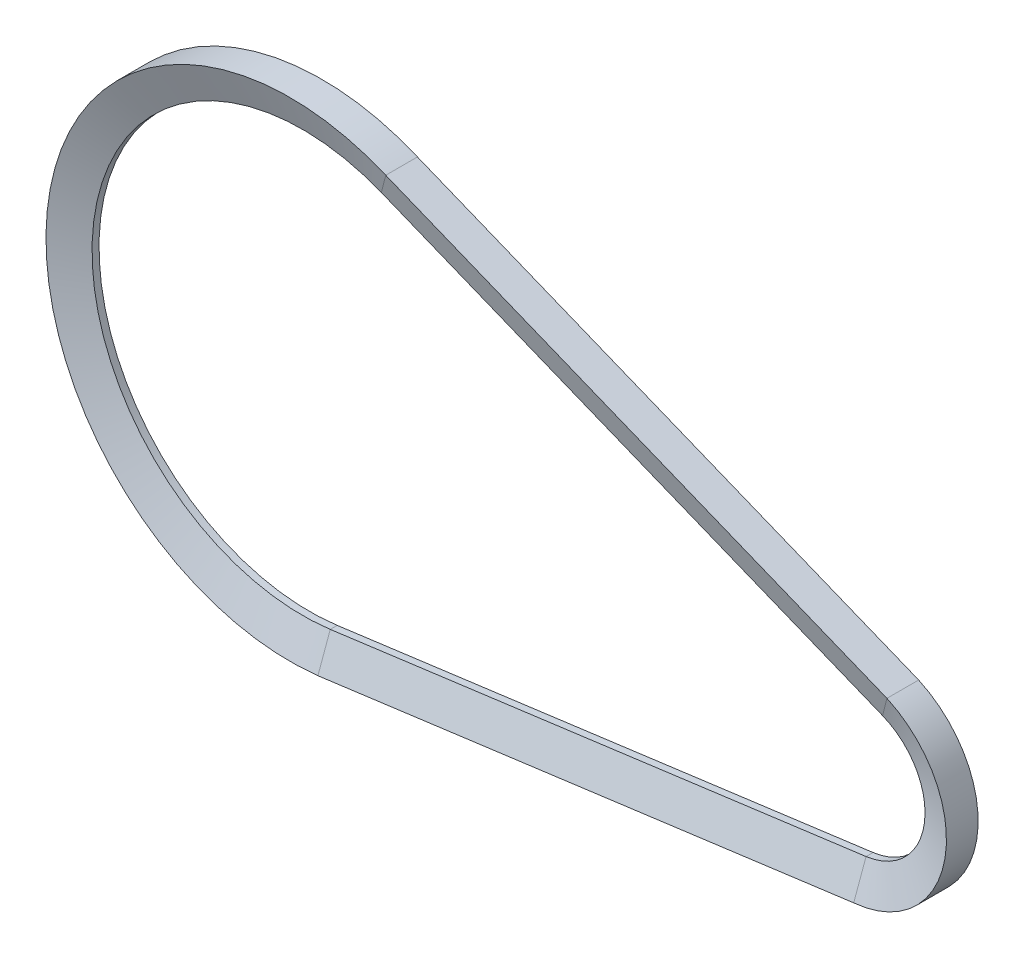
ISO-10303-21;
HEADER;
FILE_DESCRIPTION(('STEP AP214'),'2;1');
FILE_NAME('part.step','',(''),(''),'','','');
FILE_SCHEMA(('AUTOMOTIVE_DESIGN { 1 0 10303 214 1 1 1 1 }'));
ENDSEC;
DATA;
#1=APPLICATION_CONTEXT('core data for automotive mechanical design processes');
#2=APPLICATION_PROTOCOL_DEFINITION('international standard','automotive_design',2000,#1);
#3=PRODUCT_CONTEXT('',#1,'mechanical');
#4=PRODUCT('Part','Part','',(#3));
#5=PRODUCT_RELATED_PRODUCT_CATEGORY('part','',(#4));
#6=PRODUCT_DEFINITION_FORMATION('','',#4);
#7=PRODUCT_DEFINITION_CONTEXT('part definition',#1,'design');
#8=PRODUCT_DEFINITION('design','',#6,#7);
#9=PRODUCT_DEFINITION_SHAPE('','',#8);
#10=(LENGTH_UNIT() NAMED_UNIT(*) SI_UNIT(.MILLI.,.METRE.));
#11=(NAMED_UNIT(*) PLANE_ANGLE_UNIT() SI_UNIT($,.RADIAN.));
#12=(NAMED_UNIT(*) SI_UNIT($,.STERADIAN.) SOLID_ANGLE_UNIT());
#13=UNCERTAINTY_MEASURE_WITH_UNIT(LENGTH_MEASURE(1.E-05),#10,'distance_accuracy_value','');
#14=(GEOMETRIC_REPRESENTATION_CONTEXT(3) GLOBAL_UNCERTAINTY_ASSIGNED_CONTEXT((#13)) GLOBAL_UNIT_ASSIGNED_CONTEXT((#10,
#11,#12)) REPRESENTATION_CONTEXT('',''));
#15=CARTESIAN_POINT('',(0.,0.,0.));
#16=DIRECTION('',(0.,0.,1.));
#17=DIRECTION('',(1.,0.,0.));
#18=AXIS2_PLACEMENT_3D('',#15,#16,#17);
#19=CARTESIAN_POINT('',(0.,0.,0.));
#20=DIRECTION('',(0.,0.,1.));
#21=DIRECTION('',(1.,0.,0.));
#22=AXIS2_PLACEMENT_3D('',#19,#20,#21);
#23=CYLINDRICAL_SURFACE('',#22,46.5);
#24=CARTESIAN_POINT('',(0.,0.,-0.770223243003475));
#25=DIRECTION('',(0.,0.,1.));
#26=DIRECTION('',(0.374467126181139,0.927240190786421,0.));
#27=AXIS2_PLACEMENT_3D('',#24,#25,#26);
#28=CIRCLE('',#27,46.5);
#29=CARTESIAN_POINT('',(17.412721367423,43.1166688715686,-0.770223243003475));
#30=VERTEX_POINT('',#29);
#31=CARTESIAN_POINT('',(6.12472985088943,-46.0948769849061,-0.770223243003475));
#32=VERTEX_POINT('',#31);
#33=EDGE_CURVE('E11',#30,#32,#28,.T.);
#34=ORIENTED_EDGE('',*,*,#33,.F.);
#35=DIRECTION('',(0.,0.,1.));
#36=VECTOR('',#35,1.);
#37=CARTESIAN_POINT('',(17.412721367423,43.1166688715686,0.770223243003475));
#38=LINE('',#37,#36);
#39=CARTESIAN_POINT('',(17.412721367423,43.1166688715686,0.770223243003475));
#40=VERTEX_POINT('',#39);
#41=EDGE_CURVE('E36',#30,#40,#38,.T.);
#42=ORIENTED_EDGE('',*,*,#41,.T.);
#43=CARTESIAN_POINT('',(0.,0.,0.770223243003475));
#44=DIRECTION('',(0.,0.,1.));
#45=DIRECTION('',(0.374467126181139,0.927240190786421,0.));
#46=AXIS2_PLACEMENT_3D('',#43,#44,#45);
#47=CIRCLE('',#46,46.5);
#48=CARTESIAN_POINT('',(6.12472985088943,-46.0948769849061,0.770223243003475));
#49=VERTEX_POINT('',#48);
#50=EDGE_CURVE('E118',#40,#49,#47,.T.);
#51=ORIENTED_EDGE('',*,*,#50,.T.);
#52=DIRECTION('',(0.,0.,1.));
#53=VECTOR('',#52,1.);
#54=CARTESIAN_POINT('',(6.12472985088943,-46.0948769849061,0.770223243003475));
#55=LINE('',#54,#53);
#56=EDGE_CURVE('E121',#32,#49,#55,.T.);
#57=ORIENTED_EDGE('',*,*,#56,.F.);
#58=EDGE_LOOP('',(#34,#42,#51,#57));
#59=FACE_BOUND('',#58,.T.);
#60=ADVANCED_FACE('F33',(#59),#23,.F.);
#61=CARTESIAN_POINT('',(21.1127393983367,49.6404612173529,-3.5));
#62=CARTESIAN_POINT('',(-14.3055621138431,64.7043295098772,-3.5));
#63=CARTESIAN_POINT('',(-47.8541018353016,45.8397676941361,-3.5));
#64=CARTESIAN_POINT('',(-53.3840209820254,7.75044892662747,-3.5));
#65=CARTESIAN_POINT('',(-58.9139401287492,-30.3388698408812,-3.5));
#66=CARTESIAN_POINT('',(-32.1150339629088,-57.9648510588701,-3.5));
#67=CARTESIAN_POINT('',(6.12472985088941,-53.5948769849061,-3.5));
#68=CARTESIAN_POINT('',(17.412721367423,43.1166688715686,-0.770223243003475));
#69=CARTESIAN_POINT('',(-13.3508763277611,55.5405867888214,-0.770223243003475));
#70=CARTESIAN_POINT('',(-41.9674038383494,38.7522863149345,-0.770223243003475));
#71=CARTESIAN_POINT('',(-46.1321783681313,5.8371327731105,-0.770223243003475));
#72=CARTESIAN_POINT('',(-50.2969528979131,-27.0780207687135,-0.770223243003475));
#73=CARTESIAN_POINT('',(-26.763809279918,-50.4648510588701,-0.770223243003475));
#74=CARTESIAN_POINT('',(6.12472985088941,-46.0948769849061,-0.770223243003475));
#75=(BOUNDED_SURFACE() B_SPLINE_SURFACE(1,3,((#61,#62,#63,#64,#65,#66,#67),(#68,#69,#70,#71,#72,
#73,#74)),.UNSPECIFIED.,.F.,.F.,.F.) B_SPLINE_SURFACE_WITH_KNOTS((2,2),(4,3,4),(0.,1.),(0.,0.5,
1.),.UNSPECIFIED.) GEOMETRIC_REPRESENTATION_ITEM() RATIONAL_B_SPLINE_SURFACE(((1.,
0.740188803038642,0.740188803038642,1.,0.740188803038642,0.740188803038642,1.),(1.,
0.740188803038642,0.740188803038642,1.,0.740188803038642,0.740188803038642,1.))) REPRESENTATION_ITEM('') SURFACE());
#76=CARTESIAN_POINT('',(0.,0.,-3.5));
#77=DIRECTION('',(0.,0.,1.));
#78=DIRECTION('',(0.391384684427716,0.920227161517968,0.));
#79=AXIS2_PLACEMENT_3D('',#76,#77,#78);
#80=CIRCLE('',#79,53.94370356931);
#81=CARTESIAN_POINT('',(21.1127393983367,49.6404612173529,-3.5));
#82=VERTEX_POINT('',#81);
#83=CARTESIAN_POINT('',(6.12472985088943,-53.5948769849061,-3.5));
#84=VERTEX_POINT('',#83);
#85=EDGE_CURVE('E41',#82,#84,#80,.T.);
#86=DIRECTION('',(-0.463583952056587,-0.817381270249743,0.34202014332567));
#87=VECTOR('',#86,1.);
#88=CARTESIAN_POINT('',(17.412721367423,43.1166688715686,-0.770223243003475));
#89=LINE('',#88,#87);
#90=EDGE_CURVE('E187',#82,#30,#89,.T.);
#91=DIRECTION('',(0.,0.939692620785908,0.34202014332567));
#92=VECTOR('',#91,1.);
#93=CARTESIAN_POINT('',(6.12472985088943,-46.0948769849061,-0.770223243003475));
#94=LINE('',#93,#92);
#95=EDGE_CURVE('E146',#84,#32,#94,.T.);
#96=ORIENTED_EDGE('',*,*,#85,.F.);
#97=ORIENTED_EDGE('',*,*,#90,.T.);
#98=ORIENTED_EDGE('',*,*,#33,.T.);
#99=ORIENTED_EDGE('',*,*,#95,.F.);
#100=EDGE_LOOP('',(#96,#97,#98,#99));
#101=FACE_BOUND('',#100,.T.);
#102=ADVANCED_FACE('F227',(#101),#75,.T.);
#103=CARTESIAN_POINT('',(0.,0.,0.));
#104=DIRECTION('',(0.,0.,1.));
#105=DIRECTION('',(1.,0.,0.));
#106=AXIS2_PLACEMENT_3D('',#103,#104,#105);
#107=CYLINDRICAL_SURFACE('',#106,53.94370356931);
#108=CARTESIAN_POINT('',(0.,0.,3.5));
#109=DIRECTION('',(0.,0.,1.));
#110=DIRECTION('',(0.391384684427716,0.920227161517968,0.));
#111=AXIS2_PLACEMENT_3D('',#108,#109,#110);
#112=CIRCLE('',#111,53.94370356931);
#113=CARTESIAN_POINT('',(21.1127393983367,49.6404612173529,3.5));
#114=VERTEX_POINT('',#113);
#115=CARTESIAN_POINT('',(6.12472985088943,-53.5948769849061,3.5));
#116=VERTEX_POINT('',#115);
#117=EDGE_CURVE('E127',#114,#116,#112,.T.);
#118=ORIENTED_EDGE('',*,*,#117,.F.);
#119=DIRECTION('',(0.,0.,-1.));
#120=VECTOR('',#119,1.);
#121=CARTESIAN_POINT('',(21.1127393983367,49.6404612173529,3.5));
#122=LINE('',#121,#120);
#123=EDGE_CURVE('E171',#114,#82,#122,.T.);
#124=ORIENTED_EDGE('',*,*,#123,.T.);
#125=ORIENTED_EDGE('',*,*,#85,.T.);
#126=DIRECTION('',(0.,0.,-1.));
#127=VECTOR('',#126,1.);
#128=CARTESIAN_POINT('',(6.12472985088943,-53.5948769849061,3.5));
#129=LINE('',#128,#127);
#130=EDGE_CURVE('E151',#116,#84,#129,.T.);
#131=ORIENTED_EDGE('',*,*,#130,.F.);
#132=EDGE_LOOP('',(#118,#124,#125,#131));
#133=FACE_BOUND('',#132,.T.);
#134=ADVANCED_FACE('F223',(#133),#107,.T.);
#135=CARTESIAN_POINT('',(128.117006892717,-1.59139713820367,0.770223243003475));
#136=DIRECTION('',(-0.374467126181139,-0.927240190786421,0.));
#137=DIRECTION('',(0.927240190786421,-0.374467126181139,0.));
#138=AXIS2_PLACEMENT_3D('',#135,#136,#137);
#139=PLANE('',#138);
#140=ORIENTED_EDGE('',*,*,#41,.F.);
#141=DIRECTION('',(-0.927240190786421,0.374467126181139,0.));
#142=VECTOR('',#141,1.);
#143=CARTESIAN_POINT('',(128.117006892717,-1.59139713820367,-0.770223243003475));
#144=LINE('',#143,#142);
#145=CARTESIAN_POINT('',(128.117006892717,-1.59139713820366,-0.770223243003475));
#146=VERTEX_POINT('',#145);
#147=EDGE_CURVE('E49',#146,#30,#144,.T.);
#148=ORIENTED_EDGE('',*,*,#147,.F.);
#149=DIRECTION('',(0.,0.,1.));
#150=VECTOR('',#149,1.);
#151=CARTESIAN_POINT('',(128.117006892717,-1.59139713820367,0.770223243003475));
#152=LINE('',#151,#150);
#153=CARTESIAN_POINT('',(128.117006892717,-1.59139713820366,0.770223243003475));
#154=VERTEX_POINT('',#153);
#155=EDGE_CURVE('E175',#146,#154,#152,.T.);
#156=ORIENTED_EDGE('',*,*,#155,.T.);
#157=DIRECTION('',(-0.927240190786421,0.374467126181139,0.));
#158=VECTOR('',#157,1.);
#159=CARTESIAN_POINT('',(128.117006892717,-1.59139713820367,0.770223243003475));
#160=LINE('',#159,#158);
#161=EDGE_CURVE('E173',#154,#40,#160,.T.);
#162=ORIENTED_EDGE('',*,*,#161,.T.);
#163=EDGE_LOOP('',(#140,#148,#156,#162));
#164=FACE_BOUND('',#163,.T.);
#165=ADVANCED_FACE('F202',(#164),#139,.T.);
#166=CARTESIAN_POINT('',(128.117006892717,-1.59139713820367,-0.770223243003475));
#167=DIRECTION('',(-0.129067730873885,-0.319592239298412,-0.938723772697428));
#168=DIRECTION('',(0.,0.946641691748173,-0.322287926308383));
#169=AXIS2_PLACEMENT_3D('',#166,#167,#168);
#170=PLANE('',#169);
#171=ORIENTED_EDGE('',*,*,#147,.T.);
#172=ORIENTED_EDGE('',*,*,#90,.F.);
#173=DIRECTION('',(-0.927240190786421,0.374467126181139,0.));
#174=VECTOR('',#173,1.);
#175=CARTESIAN_POINT('',(131.817024923631,4.9323952075806,-3.5));
#176=LINE('',#175,#174);
#177=CARTESIAN_POINT('',(131.817024923631,4.93239520758062,-3.5));
#178=VERTEX_POINT('',#177);
#179=EDGE_CURVE('E58',#178,#82,#176,.T.);
#180=ORIENTED_EDGE('',*,*,#179,.F.);
#181=DIRECTION('',(-0.463583952056588,-0.817381270249743,0.34202014332567));
#182=VECTOR('',#181,1.);
#183=CARTESIAN_POINT('',(128.117006892717,-1.59139713820367,-0.770223243003475));
#184=LINE('',#183,#182);
#185=EDGE_CURVE('E184',#178,#146,#184,.T.);
#186=ORIENTED_EDGE('',*,*,#185,.T.);
#187=EDGE_LOOP('',(#171,#172,#180,#186));
#188=FACE_BOUND('',#187,.T.);
#189=ADVANCED_FACE('F213',(#188),#170,.T.);
#190=CARTESIAN_POINT('',(131.817024923631,4.9323952075806,3.5));
#191=DIRECTION('',(0.374467126181139,0.927240190786421,0.));
#192=DIRECTION('',(-0.927240190786421,0.374467126181139,0.));
#193=AXIS2_PLACEMENT_3D('',#190,#191,#192);
#194=PLANE('',#193);
#195=ORIENTED_EDGE('',*,*,#179,.T.);
#196=ORIENTED_EDGE('',*,*,#123,.F.);
#197=DIRECTION('',(-0.927240190786421,0.374467126181139,0.));
#198=VECTOR('',#197,1.);
#199=CARTESIAN_POINT('',(131.817024923631,4.9323952075806,3.5));
#200=LINE('',#199,#198);
#201=CARTESIAN_POINT('',(131.817024923631,4.93239520758062,3.5));
#202=VERTEX_POINT('',#201);
#203=EDGE_CURVE('E86',#202,#114,#200,.T.);
#204=ORIENTED_EDGE('',*,*,#203,.F.);
#205=DIRECTION('',(0.,0.,-1.));
#206=VECTOR('',#205,1.);
#207=CARTESIAN_POINT('',(131.817024923631,4.93239520758061,3.5));
#208=LINE('',#207,#206);
#209=EDGE_CURVE('E165',#202,#178,#208,.T.);
#210=ORIENTED_EDGE('',*,*,#209,.T.);
#211=EDGE_LOOP('',(#195,#196,#204,#210));
#212=FACE_BOUND('',#211,.T.);
#213=ADVANCED_FACE('F215',(#212),#194,.T.);
#214=CARTESIAN_POINT('',(128.117006892717,-1.59139713820367,0.770223243003475));
#215=DIRECTION('',(-0.129067730873885,-0.319592239298412,0.938723772697428));
#216=DIRECTION('',(0.,-0.946641691748173,-0.322287926308383));
#217=AXIS2_PLACEMENT_3D('',#214,#215,#216);
#218=PLANE('',#217);
#219=ORIENTED_EDGE('',*,*,#203,.T.);
#220=DIRECTION('',(0.463583952056587,0.817381270249743,0.34202014332567));
#221=VECTOR('',#220,1.);
#222=CARTESIAN_POINT('',(17.412721367423,43.1166688715686,0.770223243003475));
#223=LINE('',#222,#221);
#224=EDGE_CURVE('E169',#40,#114,#223,.T.);
#225=ORIENTED_EDGE('',*,*,#224,.F.);
#226=ORIENTED_EDGE('',*,*,#161,.F.);
#227=DIRECTION('',(0.463583952056588,0.817381270249743,0.34202014332567));
#228=VECTOR('',#227,1.);
#229=CARTESIAN_POINT('',(128.117006892717,-1.59139713820367,0.770223243003475));
#230=LINE('',#229,#228);
#231=EDGE_CURVE('E160',#154,#202,#230,.T.);
#232=ORIENTED_EDGE('',*,*,#231,.T.);
#233=EDGE_LOOP('',(#219,#225,#226,#232));
#234=FACE_BOUND('',#233,.T.);
#235=ADVANCED_FACE('F221',(#234),#218,.T.);
#236=CARTESIAN_POINT('',(122.5,-15.5,0.));
#237=DIRECTION('',(0.,0.,1.));
#238=DIRECTION('',(1.,0.,0.));
#239=AXIS2_PLACEMENT_3D('',#236,#237,#238);
#240=CYLINDRICAL_SURFACE('',#239,15.);
#241=ORIENTED_EDGE('',*,*,#155,.F.);
#242=CARTESIAN_POINT('',(122.5,-15.5,-0.770223243003475));
#243=DIRECTION('',(0.,0.,1.));
#244=DIRECTION('',(0.131714620449238,-0.991287677094754,0.));
#245=AXIS2_PLACEMENT_3D('',#242,#243,#244);
#246=CIRCLE('',#245,15.);
#247=CARTESIAN_POINT('',(124.475719306739,-30.3693151564213,-0.770223243003475));
#248=VERTEX_POINT('',#247);
#249=EDGE_CURVE('E194',#248,#146,#246,.T.);
#250=ORIENTED_EDGE('',*,*,#249,.F.);
#251=DIRECTION('',(0.,0.,1.));
#252=VECTOR('',#251,1.);
#253=CARTESIAN_POINT('',(124.475719306739,-30.3693151564213,0.770223243003475));
#254=LINE('',#253,#252);
#255=CARTESIAN_POINT('',(124.475719306739,-30.3693151564213,0.770223243003475));
#256=VERTEX_POINT('',#255);
#257=EDGE_CURVE('E168',#248,#256,#254,.T.);
#258=ORIENTED_EDGE('',*,*,#257,.T.);
#259=CARTESIAN_POINT('',(122.5,-15.5,0.770223243003475));
#260=DIRECTION('',(0.,0.,1.));
#261=DIRECTION('',(0.131714620449238,-0.991287677094754,0.));
#262=AXIS2_PLACEMENT_3D('',#259,#260,#261);
#263=CIRCLE('',#262,15.);
#264=EDGE_CURVE('E163',#256,#154,#263,.T.);
#265=ORIENTED_EDGE('',*,*,#264,.T.);
#266=EDGE_LOOP('',(#241,#250,#258,#265));
#267=FACE_BOUND('',#266,.T.);
#268=ADVANCED_FACE('F207',(#267),#240,.F.);
#269=CARTESIAN_POINT('',(124.475719306739,-37.8693151564213,-3.5));
#270=CARTESIAN_POINT('',(153.119494172499,-35.3394183480289,-3.5));
#271=CARTESIAN_POINT('',(157.980585327767,-6.99799973142355,-3.5));
#272=CARTESIAN_POINT('',(131.817024923631,4.93239520758063,-3.5));
#273=CARTESIAN_POINT('',(124.475719306739,-30.3693151564213,-0.770223243003475));
#274=CARTESIAN_POINT('',(143.515788829221,-27.8394183480289,-0.770223243003475));
#275=CARTESIAN_POINT('',(145.926890042233,-8.78394101937947,-0.770223243003475));
#276=CARTESIAN_POINT('',(128.117006892717,-1.59139713820365,-0.770223243003475));
#277=(BOUNDED_SURFACE() B_SPLINE_SURFACE(1,3,((#269,#270,#271,#272),(#273,#274,#275,#276)),
.UNSPECIFIED.,.F.,.F.,.F.) B_SPLINE_SURFACE_WITH_KNOTS((2,2),(4,4),(0.,1.),(0.,1.),
.UNSPECIFIED.) GEOMETRIC_REPRESENTATION_ITEM() RATIONAL_B_SPLINE_SURFACE(((1.,0.503405880312619,
0.503405880312619,1.),(1.,0.503405880312619,0.503405880312619,1.))) REPRESENTATION_ITEM('') SURFACE());
#278=CARTESIAN_POINT('',(122.5,-15.5,-3.5));
#279=DIRECTION('',(0.,0.,1.));
#280=DIRECTION('',(0.0879802482513944,-0.996122219367495,0.));
#281=AXIS2_PLACEMENT_3D('',#278,#279,#280);
#282=CIRCLE('',#281,22.4563961344273);
#283=CARTESIAN_POINT('',(124.475719306739,-37.8693151564213,-3.5));
#284=VERTEX_POINT('',#283);
#285=EDGE_CURVE('E99',#284,#178,#282,.T.);
#286=DIRECTION('',(0.,0.939692620785908,0.34202014332567));
#287=VECTOR('',#286,1.);
#288=CARTESIAN_POINT('',(124.475719306739,-30.3693151564213,-0.770223243003475));
#289=LINE('',#288,#287);
#290=EDGE_CURVE('E181',#284,#248,#289,.T.);
#291=ORIENTED_EDGE('',*,*,#249,.T.);
#292=ORIENTED_EDGE('',*,*,#185,.F.);
#293=ORIENTED_EDGE('',*,*,#285,.F.);
#294=ORIENTED_EDGE('',*,*,#290,.T.);
#295=EDGE_LOOP('',(#291,#292,#293,#294));
#296=FACE_BOUND('',#295,.T.);
#297=ADVANCED_FACE('F212',(#296),#277,.T.);
#298=CARTESIAN_POINT('',(122.5,-15.5,0.));
#299=DIRECTION('',(0.,0.,1.));
#300=DIRECTION('',(1.,0.,0.));
#301=AXIS2_PLACEMENT_3D('',#298,#299,#300);
#302=CYLINDRICAL_SURFACE('',#301,22.4563961344273);
#303=ORIENTED_EDGE('',*,*,#285,.T.);
#304=ORIENTED_EDGE('',*,*,#209,.F.);
#305=CARTESIAN_POINT('',(122.5,-15.5,3.5));
#306=DIRECTION('',(0.,0.,1.));
#307=DIRECTION('',(0.0879802482513944,-0.996122219367495,0.));
#308=AXIS2_PLACEMENT_3D('',#305,#306,#307);
#309=CIRCLE('',#308,22.4563961344273);
#310=CARTESIAN_POINT('',(124.475719306739,-37.8693151564213,3.5));
#311=VERTEX_POINT('',#310);
#312=EDGE_CURVE('E105',#311,#202,#309,.T.);
#313=ORIENTED_EDGE('',*,*,#312,.F.);
#314=DIRECTION('',(0.,0.,-1.));
#315=VECTOR('',#314,1.);
#316=CARTESIAN_POINT('',(124.475719306739,-37.8693151564213,3.5));
#317=LINE('',#316,#315);
#318=EDGE_CURVE('E158',#311,#284,#317,.T.);
#319=ORIENTED_EDGE('',*,*,#318,.T.);
#320=EDGE_LOOP('',(#303,#304,#313,#319));
#321=FACE_BOUND('',#320,.T.);
#322=ADVANCED_FACE('F252',(#321),#302,.T.);
#323=CARTESIAN_POINT('',(124.475719306739,-30.3693151564213,0.770223243003475));
#324=CARTESIAN_POINT('',(143.515788829221,-27.8394183480289,0.770223243003475));
#325=CARTESIAN_POINT('',(145.926890042233,-8.78394101937947,0.770223243003475));
#326=CARTESIAN_POINT('',(128.117006892717,-1.59139713820365,0.770223243003475));
#327=CARTESIAN_POINT('',(124.475719306739,-37.8693151564213,3.5));
#328=CARTESIAN_POINT('',(153.119494172499,-35.3394183480289,3.5));
#329=CARTESIAN_POINT('',(157.980585327767,-6.99799973142355,3.5));
#330=CARTESIAN_POINT('',(131.817024923631,4.93239520758063,3.5));
#331=(BOUNDED_SURFACE() B_SPLINE_SURFACE(1,3,((#323,#324,#325,#326),(#327,#328,#329,#330)),
.UNSPECIFIED.,.F.,.F.,.F.) B_SPLINE_SURFACE_WITH_KNOTS((2,2),(4,4),(0.,1.),(0.,1.),
.UNSPECIFIED.) GEOMETRIC_REPRESENTATION_ITEM() RATIONAL_B_SPLINE_SURFACE(((1.,0.503405880312619,
0.503405880312619,1.),(1.,0.503405880312619,0.503405880312619,1.))) REPRESENTATION_ITEM('') SURFACE());
#332=DIRECTION('',(0.,-0.939692620785908,0.34202014332567));
#333=VECTOR('',#332,1.);
#334=CARTESIAN_POINT('',(124.475719306739,-30.3693151564213,0.770223243003475));
#335=LINE('',#334,#333);
#336=EDGE_CURVE('E138',#256,#311,#335,.T.);
#337=ORIENTED_EDGE('',*,*,#312,.T.);
#338=ORIENTED_EDGE('',*,*,#231,.F.);
#339=ORIENTED_EDGE('',*,*,#264,.F.);
#340=ORIENTED_EDGE('',*,*,#336,.T.);
#341=EDGE_LOOP('',(#337,#338,#339,#340));
#342=FACE_BOUND('',#341,.T.);
#343=ADVANCED_FACE('F205',(#342),#331,.T.);
#344=CARTESIAN_POINT('',(6.12472985088943,-46.0948769849061,0.770223243003475));
#345=DIRECTION('',(-0.131714620449235,0.991287677094754,0.));
#346=DIRECTION('',(-0.991287677094754,-0.131714620449235,0.));
#347=AXIS2_PLACEMENT_3D('',#344,#345,#346);
#348=PLANE('',#347);
#349=ORIENTED_EDGE('',*,*,#257,.F.);
#350=DIRECTION('',(0.991287677094754,0.131714620449235,0.));
#351=VECTOR('',#350,1.);
#352=CARTESIAN_POINT('',(6.12472985088943,-46.0948769849061,-0.770223243003475));
#353=LINE('',#352,#351);
#354=EDGE_CURVE('E145',#32,#248,#353,.T.);
#355=ORIENTED_EDGE('',*,*,#354,.F.);
#356=ORIENTED_EDGE('',*,*,#56,.T.);
#357=DIRECTION('',(0.991287677094754,0.131714620449235,0.));
#358=VECTOR('',#357,1.);
#359=CARTESIAN_POINT('',(6.12472985088943,-46.0948769849061,0.770223243003475));
#360=LINE('',#359,#358);
#361=EDGE_CURVE('E133',#49,#256,#360,.T.);
#362=ORIENTED_EDGE('',*,*,#361,.T.);
#363=EDGE_LOOP('',(#349,#355,#356,#362));
#364=FACE_BOUND('',#363,.T.);
#365=ADVANCED_FACE('F143',(#364),#348,.T.);
#366=CARTESIAN_POINT('',(6.12472985088943,-46.0948769849061,-0.770223243003475));
#367=DIRECTION('',(-0.0453981297575221,0.341667511459937,-0.938723772697428));
#368=DIRECTION('',(0.,0.939692620785908,0.34202014332567));
#369=AXIS2_PLACEMENT_3D('',#366,#367,#368);
#370=PLANE('',#369);
#371=ORIENTED_EDGE('',*,*,#354,.T.);
#372=ORIENTED_EDGE('',*,*,#290,.F.);
#373=DIRECTION('',(0.991287677094754,0.131714620449235,0.));
#374=VECTOR('',#373,1.);
#375=CARTESIAN_POINT('',(6.12472985088943,-53.5948769849061,-3.5));
#376=LINE('',#375,#374);
#377=EDGE_CURVE('E178',#84,#284,#376,.T.);
#378=ORIENTED_EDGE('',*,*,#377,.F.);
#379=ORIENTED_EDGE('',*,*,#95,.T.);
#380=EDGE_LOOP('',(#371,#372,#378,#379));
#381=FACE_BOUND('',#380,.T.);
#382=ADVANCED_FACE('F209',(#381),#370,.T.);
#383=CARTESIAN_POINT('',(6.12472985088943,-53.5948769849061,3.5));
#384=DIRECTION('',(0.131714620449235,-0.991287677094754,0.));
#385=DIRECTION('',(0.991287677094755,0.131714620449235,0.));
#386=AXIS2_PLACEMENT_3D('',#383,#384,#385);
#387=PLANE('',#386);
#388=ORIENTED_EDGE('',*,*,#377,.T.);
#389=ORIENTED_EDGE('',*,*,#318,.F.);
#390=DIRECTION('',(0.991287677094754,0.131714620449235,0.));
#391=VECTOR('',#390,1.);
#392=CARTESIAN_POINT('',(6.12472985088943,-53.5948769849061,3.5));
#393=LINE('',#392,#391);
#394=EDGE_CURVE('E157',#116,#311,#393,.T.);
#395=ORIENTED_EDGE('',*,*,#394,.F.);
#396=ORIENTED_EDGE('',*,*,#130,.T.);
#397=EDGE_LOOP('',(#388,#389,#395,#396));
#398=FACE_BOUND('',#397,.T.);
#399=ADVANCED_FACE('F265',(#398),#387,.T.);
#400=CARTESIAN_POINT('',(6.12472985088943,-46.0948769849061,0.770223243003475));
#401=DIRECTION('',(-0.0453981297575221,0.341667511459937,0.938723772697428));
#402=DIRECTION('',(0.,-0.939692620785908,0.342020143325669));
#403=AXIS2_PLACEMENT_3D('',#400,#401,#402);
#404=PLANE('',#403);
#405=ORIENTED_EDGE('',*,*,#394,.T.);
#406=ORIENTED_EDGE('',*,*,#336,.F.);
#407=ORIENTED_EDGE('',*,*,#361,.F.);
#408=DIRECTION('',(0.,-0.939692620785908,0.34202014332567));
#409=VECTOR('',#408,1.);
#410=CARTESIAN_POINT('',(6.12472985088943,-46.0948769849061,0.770223243003475));
#411=LINE('',#410,#409);
#412=EDGE_CURVE('E136',#49,#116,#411,.T.);
#413=ORIENTED_EDGE('',*,*,#412,.T.);
#414=EDGE_LOOP('',(#405,#406,#407,#413));
#415=FACE_BOUND('',#414,.T.);
#416=ADVANCED_FACE('F135',(#415),#404,.T.);
#417=CARTESIAN_POINT('',(17.412721367423,43.1166688715686,0.770223243003475));
#418=CARTESIAN_POINT('',(-13.3508763277611,55.5405867888214,0.770223243003475));
#419=CARTESIAN_POINT('',(-41.9674038383494,38.7522863149345,0.770223243003475));
#420=CARTESIAN_POINT('',(-46.1321783681313,5.8371327731105,0.770223243003475));
#421=CARTESIAN_POINT('',(-50.2969528979131,-27.0780207687135,0.770223243003475));
#422=CARTESIAN_POINT('',(-26.763809279918,-50.4648510588701,0.770223243003475));
#423=CARTESIAN_POINT('',(6.12472985088941,-46.0948769849061,0.770223243003475));
#424=CARTESIAN_POINT('',(21.1127393983367,49.6404612173529,3.5));
#425=CARTESIAN_POINT('',(-14.3055621138431,64.7043295098772,3.5));
#426=CARTESIAN_POINT('',(-47.8541018353016,45.8397676941361,3.5));
#427=CARTESIAN_POINT('',(-53.3840209820254,7.75044892662747,3.5));
#428=CARTESIAN_POINT('',(-58.9139401287492,-30.3388698408812,3.5));
#429=CARTESIAN_POINT('',(-32.1150339629088,-57.9648510588701,3.5));
#430=CARTESIAN_POINT('',(6.12472985088941,-53.5948769849061,3.5));
#431=(BOUNDED_SURFACE() B_SPLINE_SURFACE(1,3,((#417,#418,#419,#420,#421,#422,#423),(#424,#425,
#426,#427,#428,#429,#430)),.UNSPECIFIED.,.F.,.F.,.F.) B_SPLINE_SURFACE_WITH_KNOTS((2,2),(4,3,4),
(0.,1.),(0.,0.5,1.),
.UNSPECIFIED.) GEOMETRIC_REPRESENTATION_ITEM() RATIONAL_B_SPLINE_SURFACE(((1.,0.740188803038642,
0.740188803038642,1.,0.740188803038642,0.740188803038642,1.),(1.,0.740188803038642,
0.740188803038642,1.,0.740188803038642,0.740188803038642,1.))) REPRESENTATION_ITEM('') SURFACE());
#432=ORIENTED_EDGE('',*,*,#224,.T.);
#433=ORIENTED_EDGE('',*,*,#117,.T.);
#434=ORIENTED_EDGE('',*,*,#412,.F.);
#435=ORIENTED_EDGE('',*,*,#50,.F.);
#436=EDGE_LOOP('',(#432,#433,#434,#435));
#437=FACE_BOUND('',#436,.T.);
#438=ADVANCED_FACE('F148',(#437),#431,.T.);
#439=CLOSED_SHELL('',(#60,#102,#134,#165,#189,#213,#235,#268,#297,#322,#343,#365,#382,#399,#416,#438));
#440=MANIFOLD_SOLID_BREP('B2',#439);
#441=ADVANCED_BREP_SHAPE_REPRESENTATION('',(#18,#440),#14);
#442=SHAPE_DEFINITION_REPRESENTATION(#9,#441);
ENDSEC;
END-ISO-10303-21;
